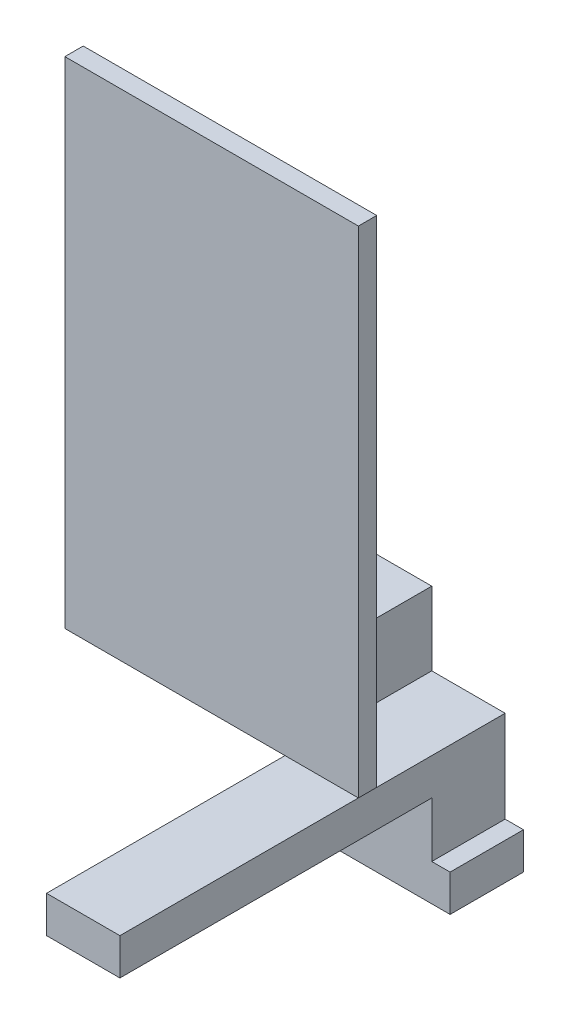
ISO-10303-21;
HEADER;
FILE_DESCRIPTION(('STEP AP214'),'2;1');
FILE_NAME('part.step','',(''),(''),'','','');
FILE_SCHEMA(('AUTOMOTIVE_DESIGN { 1 0 10303 214 1 1 1 1 }'));
ENDSEC;
DATA;
#1=APPLICATION_CONTEXT('core data for automotive mechanical design processes');
#2=APPLICATION_PROTOCOL_DEFINITION('international standard','automotive_design',2000,#1);
#3=PRODUCT_CONTEXT('',#1,'mechanical');
#4=PRODUCT('Part','Part','',(#3));
#5=PRODUCT_RELATED_PRODUCT_CATEGORY('part','',(#4));
#6=PRODUCT_DEFINITION_FORMATION('','',#4);
#7=PRODUCT_DEFINITION_CONTEXT('part definition',#1,'design');
#8=PRODUCT_DEFINITION('design','',#6,#7);
#9=PRODUCT_DEFINITION_SHAPE('','',#8);
#10=(LENGTH_UNIT() NAMED_UNIT(*) SI_UNIT(.MILLI.,.METRE.));
#11=(NAMED_UNIT(*) PLANE_ANGLE_UNIT() SI_UNIT($,.RADIAN.));
#12=(NAMED_UNIT(*) SI_UNIT($,.STERADIAN.) SOLID_ANGLE_UNIT());
#13=UNCERTAINTY_MEASURE_WITH_UNIT(LENGTH_MEASURE(1.E-05),#10,'distance_accuracy_value','');
#14=(GEOMETRIC_REPRESENTATION_CONTEXT(3) GLOBAL_UNCERTAINTY_ASSIGNED_CONTEXT((#13)) GLOBAL_UNIT_ASSIGNED_CONTEXT((#10,
#11,#12)) REPRESENTATION_CONTEXT('',''));
#15=CARTESIAN_POINT('',(0.,0.,0.));
#16=DIRECTION('',(0.,0.,1.));
#17=DIRECTION('',(1.,0.,0.));
#18=AXIS2_PLACEMENT_3D('',#15,#16,#17);
#19=CARTESIAN_POINT('',(0.,0.,0.));
#20=DIRECTION('',(0.,0.,1.));
#21=DIRECTION('',(1.,0.,0.));
#22=AXIS2_PLACEMENT_3D('',#19,#20,#21);
#23=PLANE('',#22);
#24=DIRECTION('',(-1.,0.,0.));
#25=VECTOR('',#24,1.);
#26=CARTESIAN_POINT('',(-40.,30.,0.));
#27=LINE('',#26,#25);
#28=CARTESIAN_POINT('',(-10.,30.,0.));
#29=VERTEX_POINT('',#28);
#30=CARTESIAN_POINT('',(-40.,30.,0.));
#31=VERTEX_POINT('',#30);
#32=EDGE_CURVE('E317',#29,#31,#27,.T.);
#33=ORIENTED_EDGE('',*,*,#32,.F.);
#34=DIRECTION('',(0.,-1.,0.));
#35=VECTOR('',#34,1.);
#36=CARTESIAN_POINT('',(-10.,100.,0.));
#37=LINE('',#36,#35);
#38=CARTESIAN_POINT('',(-10.,10.,0.));
#39=VERTEX_POINT('',#38);
#40=EDGE_CURVE('E199',#29,#39,#37,.T.);
#41=ORIENTED_EDGE('',*,*,#40,.T.);
#42=DIRECTION('',(1.,0.,0.));
#43=VECTOR('',#42,1.);
#44=CARTESIAN_POINT('',(10.,10.,0.));
#45=LINE('',#44,#43);
#46=CARTESIAN_POINT('',(10.,10.,0.));
#47=VERTEX_POINT('',#46);
#48=EDGE_CURVE('E196',#39,#47,#45,.T.);
#49=ORIENTED_EDGE('',*,*,#48,.T.);
#50=DIRECTION('',(0.,1.,0.));
#51=VECTOR('',#50,1.);
#52=CARTESIAN_POINT('',(10.,0.,0.));
#53=LINE('',#52,#51);
#54=CARTESIAN_POINT('',(10.,-15.,0.));
#55=VERTEX_POINT('',#54);
#56=EDGE_CURVE('E158',#55,#47,#53,.T.);
#57=ORIENTED_EDGE('',*,*,#56,.F.);
#58=DIRECTION('',(-1.,0.,0.));
#59=VECTOR('',#58,1.);
#60=CARTESIAN_POINT('',(10.,-15.,0.));
#61=LINE('',#60,#59);
#62=CARTESIAN_POINT('',(15.,-15.,0.));
#63=VERTEX_POINT('',#62);
#64=EDGE_CURVE('E154',#63,#55,#61,.T.);
#65=ORIENTED_EDGE('',*,*,#64,.F.);
#66=DIRECTION('',(0.,1.,0.));
#67=VECTOR('',#66,1.);
#68=CARTESIAN_POINT('',(15.,-15.,0.));
#69=LINE('',#68,#67);
#70=CARTESIAN_POINT('',(15.,-25.,0.));
#71=VERTEX_POINT('',#70);
#72=EDGE_CURVE('E150',#71,#63,#69,.T.);
#73=ORIENTED_EDGE('',*,*,#72,.F.);
#74=DIRECTION('',(1.,0.,0.));
#75=VECTOR('',#74,1.);
#76=CARTESIAN_POINT('',(-15.,-25.,0.));
#77=LINE('',#76,#75);
#78=CARTESIAN_POINT('',(-15.,-25.,0.));
#79=VERTEX_POINT('',#78);
#80=EDGE_CURVE('E101',#79,#71,#77,.T.);
#81=ORIENTED_EDGE('',*,*,#80,.F.);
#82=DIRECTION('',(0.,-1.,0.));
#83=VECTOR('',#82,1.);
#84=CARTESIAN_POINT('',(-15.,-15.,0.));
#85=LINE('',#84,#83);
#86=CARTESIAN_POINT('',(-15.,-15.,0.));
#87=VERTEX_POINT('',#86);
#88=EDGE_CURVE('E167',#87,#79,#85,.T.);
#89=ORIENTED_EDGE('',*,*,#88,.F.);
#90=DIRECTION('',(-1.,0.,0.));
#91=VECTOR('',#90,1.);
#92=CARTESIAN_POINT('',(-10.,-15.,0.));
#93=LINE('',#92,#91);
#94=CARTESIAN_POINT('',(-10.,-15.,0.));
#95=VERTEX_POINT('',#94);
#96=EDGE_CURVE('E135',#95,#87,#93,.T.);
#97=ORIENTED_EDGE('',*,*,#96,.F.);
#98=DIRECTION('',(0.,-1.,0.));
#99=VECTOR('',#98,1.);
#100=CARTESIAN_POINT('',(-10.,0.,0.));
#101=LINE('',#100,#99);
#102=CARTESIAN_POINT('',(-10.,0.,0.));
#103=VERTEX_POINT('',#102);
#104=EDGE_CURVE('E162',#103,#95,#101,.T.);
#105=ORIENTED_EDGE('',*,*,#104,.F.);
#106=DIRECTION('',(-1.,0.,0.));
#107=VECTOR('',#106,1.);
#108=CARTESIAN_POINT('',(-10.,0.,0.));
#109=LINE('',#108,#107);
#110=CARTESIAN_POINT('',(-40.,0.,0.));
#111=VERTEX_POINT('',#110);
#112=EDGE_CURVE('E221',#103,#111,#109,.T.);
#113=ORIENTED_EDGE('',*,*,#112,.T.);
#114=DIRECTION('',(0.,1.,0.));
#115=VECTOR('',#114,1.);
#116=CARTESIAN_POINT('',(-40.,0.,0.));
#117=LINE('',#116,#115);
#118=EDGE_CURVE('E212',#111,#31,#117,.T.);
#119=ORIENTED_EDGE('',*,*,#118,.T.);
#120=EDGE_LOOP('',(#33,#41,#49,#57,#65,#73,#81,#89,#97,#105,#113,#119));
#121=FACE_BOUND('',#120,.T.);
#122=ADVANCED_FACE('F47',(#121),#23,.F.);
#123=CARTESIAN_POINT('',(-40.,0.,131.803398874989));
#124=DIRECTION('',(-1.,0.,0.));
#125=DIRECTION('',(0.,0.,1.));
#126=AXIS2_PLACEMENT_3D('',#123,#124,#125);
#127=PLANE('',#126);
#128=DIRECTION('',(0.,1.,0.));
#129=VECTOR('',#128,1.);
#130=CARTESIAN_POINT('',(-40.,0.,20.));
#131=LINE('',#130,#129);
#132=CARTESIAN_POINT('',(-40.,0.,20.));
#133=VERTEX_POINT('',#132);
#134=CARTESIAN_POINT('',(-40.,15.,20.));
#135=VERTEX_POINT('',#134);
#136=EDGE_CURVE('E230',#133,#135,#131,.T.);
#137=ORIENTED_EDGE('',*,*,#136,.T.);
#138=DIRECTION('',(0.,0.,-1.));
#139=VECTOR('',#138,1.);
#140=CARTESIAN_POINT('',(-40.,15.,40.));
#141=LINE('',#140,#139);
#142=CARTESIAN_POINT('',(-40.,15.,40.));
#143=VERTEX_POINT('',#142);
#144=EDGE_CURVE('E320',#143,#135,#141,.T.);
#145=ORIENTED_EDGE('',*,*,#144,.F.);
#146=DIRECTION('',(0.,-1.,0.));
#147=VECTOR('',#146,1.);
#148=CARTESIAN_POINT('',(-40.,30.,40.));
#149=LINE('',#148,#147);
#150=CARTESIAN_POINT('',(-40.,30.,40.));
#151=VERTEX_POINT('',#150);
#152=EDGE_CURVE('E302',#151,#143,#149,.T.);
#153=ORIENTED_EDGE('',*,*,#152,.F.);
#154=DIRECTION('',(0.,0.,1.));
#155=VECTOR('',#154,1.);
#156=CARTESIAN_POINT('',(-40.,30.,0.));
#157=LINE('',#156,#155);
#158=EDGE_CURVE('E298',#31,#151,#157,.T.);
#159=ORIENTED_EDGE('',*,*,#158,.F.);
#160=ORIENTED_EDGE('',*,*,#118,.F.);
#161=DIRECTION('',(0.,0.,-1.));
#162=VECTOR('',#161,1.);
#163=CARTESIAN_POINT('',(-40.,0.,131.803398874989));
#164=LINE('',#163,#162);
#165=EDGE_CURVE('E210',#133,#111,#164,.T.);
#166=ORIENTED_EDGE('',*,*,#165,.F.);
#167=EDGE_LOOP('',(#137,#145,#153,#159,#160,#166));
#168=FACE_BOUND('',#167,.T.);
#169=ADVANCED_FACE('F260',(#168),#127,.T.);
#170=CARTESIAN_POINT('',(-10.,100.,131.803398874989));
#171=DIRECTION('',(1.,0.,0.));
#172=DIRECTION('',(0.,1.,0.));
#173=AXIS2_PLACEMENT_3D('',#170,#171,#172);
#174=PLANE('',#173);
#175=ORIENTED_EDGE('',*,*,#40,.F.);
#176=DIRECTION('',(0.,0.,-1.));
#177=VECTOR('',#176,1.);
#178=CARTESIAN_POINT('',(-10.,30.,0.));
#179=LINE('',#178,#177);
#180=CARTESIAN_POINT('',(-10.,30.,40.));
#181=VERTEX_POINT('',#180);
#182=EDGE_CURVE('E311',#181,#29,#179,.T.);
#183=ORIENTED_EDGE('',*,*,#182,.F.);
#184=DIRECTION('',(0.,1.,0.));
#185=VECTOR('',#184,1.);
#186=CARTESIAN_POINT('',(-10.,15.,40.));
#187=LINE('',#186,#185);
#188=CARTESIAN_POINT('',(-10.,15.,40.));
#189=VERTEX_POINT('',#188);
#190=EDGE_CURVE('E488',#189,#181,#187,.T.);
#191=ORIENTED_EDGE('',*,*,#190,.F.);
#192=DIRECTION('',(0.,0.,-1.));
#193=VECTOR('',#192,1.);
#194=CARTESIAN_POINT('',(-10.,15.,40.));
#195=LINE('',#194,#193);
#196=CARTESIAN_POINT('',(-10.,15.,20.));
#197=VERTEX_POINT('',#196);
#198=EDGE_CURVE('E312',#189,#197,#195,.T.);
#199=ORIENTED_EDGE('',*,*,#198,.T.);
#200=DIRECTION('',(0.,-1.,0.));
#201=VECTOR('',#200,1.);
#202=CARTESIAN_POINT('',(-10.,100.,20.));
#203=LINE('',#202,#201);
#204=CARTESIAN_POINT('',(-10.,10.,20.));
#205=VERTEX_POINT('',#204);
#206=EDGE_CURVE('E225',#197,#205,#203,.T.);
#207=ORIENTED_EDGE('',*,*,#206,.T.);
#208=DIRECTION('',(0.,0.,-1.));
#209=VECTOR('',#208,1.);
#210=CARTESIAN_POINT('',(-10.,10.,131.803398874989));
#211=LINE('',#210,#209);
#212=EDGE_CURVE('E229',#205,#39,#211,.T.);
#213=ORIENTED_EDGE('',*,*,#212,.T.);
#214=EDGE_LOOP('',(#175,#183,#191,#199,#207,#213));
#215=FACE_BOUND('',#214,.T.);
#216=ADVANCED_FACE('F266',(#215),#174,.T.);
#217=CARTESIAN_POINT('',(0.,0.,20.));
#218=DIRECTION('',(0.,0.,1.));
#219=DIRECTION('',(1.,0.,0.));
#220=AXIS2_PLACEMENT_3D('',#217,#218,#219);
#221=PLANE('',#220);
#222=ORIENTED_EDGE('',*,*,#206,.F.);
#223=DIRECTION('',(1.,0.,0.));
#224=VECTOR('',#223,1.);
#225=CARTESIAN_POINT('',(-65.,15.,20.));
#226=LINE('',#225,#224);
#227=EDGE_CURVE('E326',#135,#197,#226,.T.);
#228=ORIENTED_EDGE('',*,*,#227,.F.);
#229=ORIENTED_EDGE('',*,*,#136,.F.);
#230=DIRECTION('',(-1.,0.,0.));
#231=VECTOR('',#230,1.);
#232=CARTESIAN_POINT('',(-10.,0.,20.));
#233=LINE('',#232,#231);
#234=CARTESIAN_POINT('',(-10.,0.,20.));
#235=VERTEX_POINT('',#234);
#236=EDGE_CURVE('E205',#235,#133,#233,.T.);
#237=ORIENTED_EDGE('',*,*,#236,.F.);
#238=DIRECTION('',(0.,-1.,0.));
#239=VECTOR('',#238,1.);
#240=CARTESIAN_POINT('',(-10.,10.,20.));
#241=LINE('',#240,#239);
#242=EDGE_CURVE('E350',#205,#235,#241,.T.);
#243=ORIENTED_EDGE('',*,*,#242,.F.);
#244=EDGE_LOOP('',(#222,#228,#229,#237,#243));
#245=FACE_BOUND('',#244,.T.);
#246=ADVANCED_FACE('F271',(#245),#221,.T.);
#247=DIRECTION('',(1.,0.,0.));
#248=VECTOR('',#247,1.);
#249=CARTESIAN_POINT('',(10.,0.,20.));
#250=LINE('',#249,#248);
#251=CARTESIAN_POINT('',(10.,0.,20.));
#252=VERTEX_POINT('',#251);
#253=EDGE_CURVE('E356',#235,#252,#250,.T.);
#254=ORIENTED_EDGE('',*,*,#253,.F.);
#255=DIRECTION('',(0.,-1.,0.));
#256=VECTOR('',#255,1.);
#257=CARTESIAN_POINT('',(-10.,0.,20.));
#258=LINE('',#257,#256);
#259=CARTESIAN_POINT('',(-10.,-15.,20.));
#260=VERTEX_POINT('',#259);
#261=EDGE_CURVE('E125',#235,#260,#258,.T.);
#262=ORIENTED_EDGE('',*,*,#261,.T.);
#263=DIRECTION('',(-1.,0.,0.));
#264=VECTOR('',#263,1.);
#265=CARTESIAN_POINT('',(-10.,-15.,20.));
#266=LINE('',#265,#264);
#267=CARTESIAN_POINT('',(-15.,-15.,20.));
#268=VERTEX_POINT('',#267);
#269=EDGE_CURVE('E118',#260,#268,#266,.T.);
#270=ORIENTED_EDGE('',*,*,#269,.T.);
#271=DIRECTION('',(0.,-1.,0.));
#272=VECTOR('',#271,1.);
#273=CARTESIAN_POINT('',(-15.,-15.,20.));
#274=LINE('',#273,#272);
#275=CARTESIAN_POINT('',(-15.,-25.,20.));
#276=VERTEX_POINT('',#275);
#277=EDGE_CURVE('E122',#268,#276,#274,.T.);
#278=ORIENTED_EDGE('',*,*,#277,.T.);
#279=DIRECTION('',(1.,0.,0.));
#280=VECTOR('',#279,1.);
#281=CARTESIAN_POINT('',(-15.,-25.,20.));
#282=LINE('',#281,#280);
#283=CARTESIAN_POINT('',(15.,-25.,20.));
#284=VERTEX_POINT('',#283);
#285=EDGE_CURVE('E71',#276,#284,#282,.T.);
#286=ORIENTED_EDGE('',*,*,#285,.T.);
#287=DIRECTION('',(0.,1.,0.));
#288=VECTOR('',#287,1.);
#289=CARTESIAN_POINT('',(15.,-15.,20.));
#290=LINE('',#289,#288);
#291=CARTESIAN_POINT('',(15.,-15.,20.));
#292=VERTEX_POINT('',#291);
#293=EDGE_CURVE('E172',#284,#292,#290,.T.);
#294=ORIENTED_EDGE('',*,*,#293,.T.);
#295=DIRECTION('',(-1.,0.,0.));
#296=VECTOR('',#295,1.);
#297=CARTESIAN_POINT('',(10.,-15.,20.));
#298=LINE('',#297,#296);
#299=CARTESIAN_POINT('',(10.,-15.,20.));
#300=VERTEX_POINT('',#299);
#301=EDGE_CURVE('E108',#292,#300,#298,.T.);
#302=ORIENTED_EDGE('',*,*,#301,.T.);
#303=DIRECTION('',(0.,1.,0.));
#304=VECTOR('',#303,1.);
#305=CARTESIAN_POINT('',(10.,0.,20.));
#306=LINE('',#305,#304);
#307=EDGE_CURVE('E63',#300,#252,#306,.T.);
#308=ORIENTED_EDGE('',*,*,#307,.T.);
#309=EDGE_LOOP('',(#254,#262,#270,#278,#286,#294,#302,#308));
#310=FACE_BOUND('',#309,.T.);
#311=ADVANCED_FACE('F120',(#310),#221,.T.);
#312=CARTESIAN_POINT('',(15.,-15.,20.));
#313=DIRECTION('',(-1.,0.,0.));
#314=DIRECTION('',(0.,0.,1.));
#315=AXIS2_PLACEMENT_3D('',#312,#313,#314);
#316=PLANE('',#315);
#317=ORIENTED_EDGE('',*,*,#72,.T.);
#318=DIRECTION('',(0.,0.,-1.));
#319=VECTOR('',#318,1.);
#320=CARTESIAN_POINT('',(15.,-15.,20.));
#321=LINE('',#320,#319);
#322=EDGE_CURVE('E11',#292,#63,#321,.T.);
#323=ORIENTED_EDGE('',*,*,#322,.F.);
#324=ORIENTED_EDGE('',*,*,#293,.F.);
#325=DIRECTION('',(0.,0.,-1.));
#326=VECTOR('',#325,1.);
#327=CARTESIAN_POINT('',(15.,-25.,20.));
#328=LINE('',#327,#326);
#329=EDGE_CURVE('E146',#284,#71,#328,.T.);
#330=ORIENTED_EDGE('',*,*,#329,.T.);
#331=EDGE_LOOP('',(#317,#323,#324,#330));
#332=FACE_BOUND('',#331,.T.);
#333=ADVANCED_FACE('F49',(#332),#316,.F.);
#334=CARTESIAN_POINT('',(10.,-15.,20.));
#335=DIRECTION('',(0.,-1.,0.));
#336=DIRECTION('',(0.,0.,-1.));
#337=AXIS2_PLACEMENT_3D('',#334,#335,#336);
#338=PLANE('',#337);
#339=ORIENTED_EDGE('',*,*,#64,.T.);
#340=DIRECTION('',(0.,0.,-1.));
#341=VECTOR('',#340,1.);
#342=CARTESIAN_POINT('',(10.,-15.,20.));
#343=LINE('',#342,#341);
#344=EDGE_CURVE('E56',#300,#55,#343,.T.);
#345=ORIENTED_EDGE('',*,*,#344,.F.);
#346=ORIENTED_EDGE('',*,*,#301,.F.);
#347=ORIENTED_EDGE('',*,*,#322,.T.);
#348=EDGE_LOOP('',(#339,#345,#346,#347));
#349=FACE_BOUND('',#348,.T.);
#350=ADVANCED_FACE('F250',(#349),#338,.F.);
#351=CARTESIAN_POINT('',(10.,0.,20.));
#352=DIRECTION('',(-1.,0.,0.));
#353=DIRECTION('',(0.,-1.,0.));
#354=AXIS2_PLACEMENT_3D('',#351,#352,#353);
#355=PLANE('',#354);
#356=ORIENTED_EDGE('',*,*,#56,.T.);
#357=DIRECTION('',(0.,0.,-1.));
#358=VECTOR('',#357,1.);
#359=CARTESIAN_POINT('',(10.,10.,131.803398874989));
#360=LINE('',#359,#358);
#361=CARTESIAN_POINT('',(10.,10.,105.));
#362=VERTEX_POINT('',#361);
#363=EDGE_CURVE('E155',#362,#47,#360,.T.);
#364=ORIENTED_EDGE('',*,*,#363,.F.);
#365=DIRECTION('',(0.,1.,0.));
#366=VECTOR('',#365,1.);
#367=CARTESIAN_POINT('',(10.,10.,105.));
#368=LINE('',#367,#366);
#369=CARTESIAN_POINT('',(10.,0.,105.));
#370=VERTEX_POINT('',#369);
#371=EDGE_CURVE('E351',#370,#362,#368,.T.);
#372=ORIENTED_EDGE('',*,*,#371,.F.);
#373=DIRECTION('',(0.,0.,-1.));
#374=VECTOR('',#373,1.);
#375=CARTESIAN_POINT('',(10.,0.,105.));
#376=LINE('',#375,#374);
#377=EDGE_CURVE('E368',#370,#252,#376,.T.);
#378=ORIENTED_EDGE('',*,*,#377,.T.);
#379=ORIENTED_EDGE('',*,*,#307,.F.);
#380=ORIENTED_EDGE('',*,*,#344,.T.);
#381=EDGE_LOOP('',(#356,#364,#372,#378,#379,#380));
#382=FACE_BOUND('',#381,.T.);
#383=ADVANCED_FACE('F186',(#382),#355,.F.);
#384=CARTESIAN_POINT('',(-10.,0.,20.));
#385=DIRECTION('',(1.,0.,0.));
#386=DIRECTION('',(0.,1.,0.));
#387=AXIS2_PLACEMENT_3D('',#384,#385,#386);
#388=PLANE('',#387);
#389=ORIENTED_EDGE('',*,*,#104,.T.);
#390=DIRECTION('',(0.,0.,-1.));
#391=VECTOR('',#390,1.);
#392=CARTESIAN_POINT('',(-10.,-15.,20.));
#393=LINE('',#392,#391);
#394=EDGE_CURVE('E139',#260,#95,#393,.T.);
#395=ORIENTED_EDGE('',*,*,#394,.F.);
#396=ORIENTED_EDGE('',*,*,#261,.F.);
#397=DIRECTION('',(0.,0.,-1.));
#398=VECTOR('',#397,1.);
#399=CARTESIAN_POINT('',(-10.,0.,20.));
#400=LINE('',#399,#398);
#401=EDGE_CURVE('E179',#235,#103,#400,.T.);
#402=ORIENTED_EDGE('',*,*,#401,.T.);
#403=EDGE_LOOP('',(#389,#395,#396,#402));
#404=FACE_BOUND('',#403,.T.);
#405=ADVANCED_FACE('F257',(#404),#388,.F.);
#406=CARTESIAN_POINT('',(-10.,-15.,20.));
#407=DIRECTION('',(0.,-1.,0.));
#408=DIRECTION('',(0.,0.,-1.));
#409=AXIS2_PLACEMENT_3D('',#406,#407,#408);
#410=PLANE('',#409);
#411=ORIENTED_EDGE('',*,*,#96,.T.);
#412=DIRECTION('',(0.,0.,-1.));
#413=VECTOR('',#412,1.);
#414=CARTESIAN_POINT('',(-15.,-15.,20.));
#415=LINE('',#414,#413);
#416=EDGE_CURVE('E132',#268,#87,#415,.T.);
#417=ORIENTED_EDGE('',*,*,#416,.F.);
#418=ORIENTED_EDGE('',*,*,#269,.F.);
#419=ORIENTED_EDGE('',*,*,#394,.T.);
#420=EDGE_LOOP('',(#411,#417,#418,#419));
#421=FACE_BOUND('',#420,.T.);
#422=ADVANCED_FACE('F133',(#421),#410,.F.);
#423=CARTESIAN_POINT('',(-15.,-15.,20.));
#424=DIRECTION('',(1.,0.,0.));
#425=DIRECTION('',(0.,1.,0.));
#426=AXIS2_PLACEMENT_3D('',#423,#424,#425);
#427=PLANE('',#426);
#428=ORIENTED_EDGE('',*,*,#88,.T.);
#429=DIRECTION('',(0.,0.,-1.));
#430=VECTOR('',#429,1.);
#431=CARTESIAN_POINT('',(-15.,-25.,20.));
#432=LINE('',#431,#430);
#433=EDGE_CURVE('E140',#276,#79,#432,.T.);
#434=ORIENTED_EDGE('',*,*,#433,.F.);
#435=ORIENTED_EDGE('',*,*,#277,.F.);
#436=ORIENTED_EDGE('',*,*,#416,.T.);
#437=EDGE_LOOP('',(#428,#434,#435,#436));
#438=FACE_BOUND('',#437,.T.);
#439=ADVANCED_FACE('F142',(#438),#427,.F.);
#440=CARTESIAN_POINT('',(-15.,-25.,20.));
#441=DIRECTION('',(0.,1.,0.));
#442=DIRECTION('',(-1.,0.,0.));
#443=AXIS2_PLACEMENT_3D('',#440,#441,#442);
#444=PLANE('',#443);
#445=ORIENTED_EDGE('',*,*,#80,.T.);
#446=ORIENTED_EDGE('',*,*,#329,.F.);
#447=ORIENTED_EDGE('',*,*,#285,.F.);
#448=ORIENTED_EDGE('',*,*,#433,.T.);
#449=EDGE_LOOP('',(#445,#446,#447,#448));
#450=FACE_BOUND('',#449,.T.);
#451=ADVANCED_FACE('F273',(#450),#444,.F.);
#452=CARTESIAN_POINT('',(-10.,0.,131.803398874989));
#453=DIRECTION('',(0.,-1.,0.));
#454=DIRECTION('',(1.,0.,0.));
#455=AXIS2_PLACEMENT_3D('',#452,#453,#454);
#456=PLANE('',#455);
#457=ORIENTED_EDGE('',*,*,#401,.F.);
#458=ORIENTED_EDGE('',*,*,#236,.T.);
#459=ORIENTED_EDGE('',*,*,#165,.T.);
#460=ORIENTED_EDGE('',*,*,#112,.F.);
#461=EDGE_LOOP('',(#457,#458,#459,#460));
#462=FACE_BOUND('',#461,.T.);
#463=ADVANCED_FACE('F276',(#462),#456,.T.);
#464=CARTESIAN_POINT('',(10.,10.,131.803398874989));
#465=DIRECTION('',(0.,1.,0.));
#466=DIRECTION('',(0.,0.,1.));
#467=AXIS2_PLACEMENT_3D('',#464,#465,#466);
#468=PLANE('',#467);
#469=ORIENTED_EDGE('',*,*,#212,.F.);
#470=DIRECTION('',(0.,0.,-1.));
#471=VECTOR('',#470,1.);
#472=CARTESIAN_POINT('',(-10.,10.,105.));
#473=LINE('',#472,#471);
#474=CARTESIAN_POINT('',(-10.,10.,105.));
#475=VERTEX_POINT('',#474);
#476=EDGE_CURVE('E215',#475,#205,#473,.T.);
#477=ORIENTED_EDGE('',*,*,#476,.F.);
#478=DIRECTION('',(-1.,0.,0.));
#479=VECTOR('',#478,1.);
#480=CARTESIAN_POINT('',(10.,10.,105.));
#481=LINE('',#480,#479);
#482=EDGE_CURVE('E355',#362,#475,#481,.T.);
#483=ORIENTED_EDGE('',*,*,#482,.F.);
#484=ORIENTED_EDGE('',*,*,#363,.T.);
#485=ORIENTED_EDGE('',*,*,#48,.F.);
#486=EDGE_LOOP('',(#469,#477,#483,#484,#485));
#487=FACE_BOUND('',#486,.T.);
#488=ADVANCED_FACE('F392',(#487),#468,.T.);
#489=CARTESIAN_POINT('',(-10.,10.,105.));
#490=DIRECTION('',(1.,0.,0.));
#491=DIRECTION('',(0.,0.,-1.));
#492=AXIS2_PLACEMENT_3D('',#489,#490,#491);
#493=PLANE('',#492);
#494=ORIENTED_EDGE('',*,*,#242,.T.);
#495=DIRECTION('',(0.,0.,-1.));
#496=VECTOR('',#495,1.);
#497=CARTESIAN_POINT('',(-10.,0.,105.));
#498=LINE('',#497,#496);
#499=CARTESIAN_POINT('',(-10.,0.,105.));
#500=VERTEX_POINT('',#499);
#501=EDGE_CURVE('E375',#500,#235,#498,.T.);
#502=ORIENTED_EDGE('',*,*,#501,.F.);
#503=DIRECTION('',(0.,-1.,0.));
#504=VECTOR('',#503,1.);
#505=CARTESIAN_POINT('',(-10.,10.,105.));
#506=LINE('',#505,#504);
#507=EDGE_CURVE('E360',#475,#500,#506,.T.);
#508=ORIENTED_EDGE('',*,*,#507,.F.);
#509=ORIENTED_EDGE('',*,*,#476,.T.);
#510=EDGE_LOOP('',(#494,#502,#508,#509));
#511=FACE_BOUND('',#510,.T.);
#512=ADVANCED_FACE('F387',(#511),#493,.F.);
#513=CARTESIAN_POINT('',(10.,0.,105.));
#514=DIRECTION('',(0.,1.,0.));
#515=DIRECTION('',(0.,0.,1.));
#516=AXIS2_PLACEMENT_3D('',#513,#514,#515);
#517=PLANE('',#516);
#518=ORIENTED_EDGE('',*,*,#253,.T.);
#519=ORIENTED_EDGE('',*,*,#377,.F.);
#520=DIRECTION('',(1.,0.,0.));
#521=VECTOR('',#520,1.);
#522=CARTESIAN_POINT('',(10.,0.,105.));
#523=LINE('',#522,#521);
#524=EDGE_CURVE('E364',#500,#370,#523,.T.);
#525=ORIENTED_EDGE('',*,*,#524,.F.);
#526=ORIENTED_EDGE('',*,*,#501,.T.);
#527=EDGE_LOOP('',(#518,#519,#525,#526));
#528=FACE_BOUND('',#527,.T.);
#529=ADVANCED_FACE('F514',(#528),#517,.F.);
#530=CARTESIAN_POINT('',(0.,0.,105.));
#531=DIRECTION('',(0.,0.,-1.));
#532=DIRECTION('',(-1.,0.,0.));
#533=AXIS2_PLACEMENT_3D('',#530,#531,#532);
#534=PLANE('',#533);
#535=ORIENTED_EDGE('',*,*,#371,.T.);
#536=ORIENTED_EDGE('',*,*,#482,.T.);
#537=ORIENTED_EDGE('',*,*,#507,.T.);
#538=ORIENTED_EDGE('',*,*,#524,.T.);
#539=EDGE_LOOP('',(#535,#536,#537,#538));
#540=FACE_BOUND('',#539,.T.);
#541=ADVANCED_FACE('F506',(#540),#534,.F.);
#542=CARTESIAN_POINT('',(-65.,100.,45.));
#543=DIRECTION('',(1.,0.,0.));
#544=DIRECTION('',(0.,1.,0.));
#545=AXIS2_PLACEMENT_3D('',#542,#543,#544);
#546=PLANE('',#545);
#547=DIRECTION('',(0.,-1.,0.));
#548=VECTOR('',#547,1.);
#549=CARTESIAN_POINT('',(-65.,100.,45.));
#550=LINE('',#549,#548);
#551=CARTESIAN_POINT('',(-65.,150.,45.));
#552=VERTEX_POINT('',#551);
#553=CARTESIAN_POINT('',(-65.,15.,45.));
#554=VERTEX_POINT('',#553);
#555=EDGE_CURVE('E327',#552,#554,#550,.T.);
#556=ORIENTED_EDGE('',*,*,#555,.F.);
#557=DIRECTION('',(0.,0.,1.));
#558=VECTOR('',#557,1.);
#559=CARTESIAN_POINT('',(-65.,150.,40.));
#560=LINE('',#559,#558);
#561=CARTESIAN_POINT('',(-65.,150.,40.));
#562=VERTEX_POINT('',#561);
#563=EDGE_CURVE('E463',#562,#552,#560,.T.);
#564=ORIENTED_EDGE('',*,*,#563,.F.);
#565=DIRECTION('',(0.,1.,0.));
#566=VECTOR('',#565,1.);
#567=CARTESIAN_POINT('',(-65.,15.,40.));
#568=LINE('',#567,#566);
#569=CARTESIAN_POINT('',(-65.,15.,40.));
#570=VERTEX_POINT('',#569);
#571=EDGE_CURVE('E453',#570,#562,#568,.T.);
#572=ORIENTED_EDGE('',*,*,#571,.F.);
#573=DIRECTION('',(0.,0.,-1.));
#574=VECTOR('',#573,1.);
#575=CARTESIAN_POINT('',(-65.,15.,45.));
#576=LINE('',#575,#574);
#577=EDGE_CURVE('E346',#554,#570,#576,.T.);
#578=ORIENTED_EDGE('',*,*,#577,.F.);
#579=EDGE_LOOP('',(#556,#564,#572,#578));
#580=FACE_BOUND('',#579,.T.);
#581=ADVANCED_FACE('F504',(#580),#546,.F.);
#582=CARTESIAN_POINT('',(-65.,15.,45.));
#583=DIRECTION('',(0.,1.,0.));
#584=DIRECTION('',(0.,0.,1.));
#585=AXIS2_PLACEMENT_3D('',#582,#583,#584);
#586=PLANE('',#585);
#587=DIRECTION('',(-1.,0.,0.));
#588=VECTOR('',#587,1.);
#589=CARTESIAN_POINT('',(-40.,15.,40.));
#590=LINE('',#589,#588);
#591=EDGE_CURVE('E481',#143,#570,#590,.T.);
#592=ORIENTED_EDGE('',*,*,#591,.F.);
#593=ORIENTED_EDGE('',*,*,#144,.T.);
#594=ORIENTED_EDGE('',*,*,#227,.T.);
#595=ORIENTED_EDGE('',*,*,#198,.F.);
#596=DIRECTION('',(-1.,0.,0.));
#597=VECTOR('',#596,1.);
#598=CARTESIAN_POINT('',(15.,15.,40.));
#599=LINE('',#598,#597);
#600=CARTESIAN_POINT('',(15.,15.,40.));
#601=VERTEX_POINT('',#600);
#602=EDGE_CURVE('E452',#601,#189,#599,.T.);
#603=ORIENTED_EDGE('',*,*,#602,.F.);
#604=DIRECTION('',(0.,0.,-1.));
#605=VECTOR('',#604,1.);
#606=CARTESIAN_POINT('',(15.,15.,45.));
#607=LINE('',#606,#605);
#608=CARTESIAN_POINT('',(15.,15.,45.));
#609=VERTEX_POINT('',#608);
#610=EDGE_CURVE('E339',#609,#601,#607,.T.);
#611=ORIENTED_EDGE('',*,*,#610,.F.);
#612=DIRECTION('',(1.,0.,0.));
#613=VECTOR('',#612,1.);
#614=CARTESIAN_POINT('',(-65.,15.,45.));
#615=LINE('',#614,#613);
#616=EDGE_CURVE('E331',#554,#609,#615,.T.);
#617=ORIENTED_EDGE('',*,*,#616,.F.);
#618=ORIENTED_EDGE('',*,*,#577,.T.);
#619=EDGE_LOOP('',(#592,#593,#594,#595,#603,#611,#617,#618));
#620=FACE_BOUND('',#619,.T.);
#621=ADVANCED_FACE('F496',(#620),#586,.F.);
#622=CARTESIAN_POINT('',(15.,100.,45.));
#623=DIRECTION('',(-1.,0.,0.));
#624=DIRECTION('',(0.,-1.,0.));
#625=AXIS2_PLACEMENT_3D('',#622,#623,#624);
#626=PLANE('',#625);
#627=ORIENTED_EDGE('',*,*,#610,.T.);
#628=DIRECTION('',(0.,-1.,0.));
#629=VECTOR('',#628,1.);
#630=CARTESIAN_POINT('',(15.,100.,40.));
#631=LINE('',#630,#629);
#632=CARTESIAN_POINT('',(15.,150.,40.));
#633=VERTEX_POINT('',#632);
#634=EDGE_CURVE('E443',#633,#601,#631,.T.);
#635=ORIENTED_EDGE('',*,*,#634,.F.);
#636=DIRECTION('',(0.,0.,-1.));
#637=VECTOR('',#636,1.);
#638=CARTESIAN_POINT('',(15.,150.,45.));
#639=LINE('',#638,#637);
#640=CARTESIAN_POINT('',(15.,150.,45.));
#641=VERTEX_POINT('',#640);
#642=EDGE_CURVE('E448',#641,#633,#639,.T.);
#643=ORIENTED_EDGE('',*,*,#642,.F.);
#644=DIRECTION('',(0.,1.,0.));
#645=VECTOR('',#644,1.);
#646=CARTESIAN_POINT('',(15.,100.,45.));
#647=LINE('',#646,#645);
#648=EDGE_CURVE('E335',#609,#641,#647,.T.);
#649=ORIENTED_EDGE('',*,*,#648,.F.);
#650=EDGE_LOOP('',(#627,#635,#643,#649));
#651=FACE_BOUND('',#650,.T.);
#652=ADVANCED_FACE('F445',(#651),#626,.F.);
#653=CARTESIAN_POINT('',(0.,0.,45.));
#654=DIRECTION('',(0.,0.,1.));
#655=DIRECTION('',(1.,0.,0.));
#656=AXIS2_PLACEMENT_3D('',#653,#654,#655);
#657=PLANE('',#656);
#658=ORIENTED_EDGE('',*,*,#555,.T.);
#659=ORIENTED_EDGE('',*,*,#616,.T.);
#660=ORIENTED_EDGE('',*,*,#648,.T.);
#661=DIRECTION('',(1.,0.,0.));
#662=VECTOR('',#661,1.);
#663=CARTESIAN_POINT('',(-65.,150.,45.));
#664=LINE('',#663,#662);
#665=EDGE_CURVE('E468',#552,#641,#664,.T.);
#666=ORIENTED_EDGE('',*,*,#665,.F.);
#667=EDGE_LOOP('',(#658,#659,#660,#666));
#668=FACE_BOUND('',#667,.T.);
#669=ADVANCED_FACE('F501',(#668),#657,.T.);
#670=CARTESIAN_POINT('',(0.,30.,0.));
#671=DIRECTION('',(0.,1.,0.));
#672=DIRECTION('',(-1.,0.,0.));
#673=AXIS2_PLACEMENT_3D('',#670,#671,#672);
#674=PLANE('',#673);
#675=ORIENTED_EDGE('',*,*,#158,.T.);
#676=DIRECTION('',(-1.,0.,0.));
#677=VECTOR('',#676,1.);
#678=CARTESIAN_POINT('',(-10.,30.,40.));
#679=LINE('',#678,#677);
#680=EDGE_CURVE('E476',#181,#151,#679,.T.);
#681=ORIENTED_EDGE('',*,*,#680,.F.);
#682=ORIENTED_EDGE('',*,*,#182,.T.);
#683=ORIENTED_EDGE('',*,*,#32,.T.);
#684=EDGE_LOOP('',(#675,#681,#682,#683));
#685=FACE_BOUND('',#684,.T.);
#686=ADVANCED_FACE('F600',(#685),#674,.T.);
#687=CARTESIAN_POINT('',(0.,0.,40.));
#688=DIRECTION('',(0.,0.,1.));
#689=DIRECTION('',(1.,0.,0.));
#690=AXIS2_PLACEMENT_3D('',#687,#688,#689);
#691=PLANE('',#690);
#692=ORIENTED_EDGE('',*,*,#680,.T.);
#693=ORIENTED_EDGE('',*,*,#152,.T.);
#694=ORIENTED_EDGE('',*,*,#591,.T.);
#695=ORIENTED_EDGE('',*,*,#571,.T.);
#696=DIRECTION('',(-1.,0.,0.));
#697=VECTOR('',#696,1.);
#698=CARTESIAN_POINT('',(15.,150.,40.));
#699=LINE('',#698,#697);
#700=EDGE_CURVE('E456',#633,#562,#699,.T.);
#701=ORIENTED_EDGE('',*,*,#700,.F.);
#702=ORIENTED_EDGE('',*,*,#634,.T.);
#703=ORIENTED_EDGE('',*,*,#602,.T.);
#704=ORIENTED_EDGE('',*,*,#190,.T.);
#705=EDGE_LOOP('',(#692,#693,#694,#695,#701,#702,#703,#704));
#706=FACE_BOUND('',#705,.T.);
#707=ADVANCED_FACE('F457',(#706),#691,.F.);
#708=CARTESIAN_POINT('',(0.,150.,0.));
#709=DIRECTION('',(0.,1.,0.));
#710=DIRECTION('',(-1.,0.,0.));
#711=AXIS2_PLACEMENT_3D('',#708,#709,#710);
#712=PLANE('',#711);
#713=ORIENTED_EDGE('',*,*,#642,.T.);
#714=ORIENTED_EDGE('',*,*,#700,.T.);
#715=ORIENTED_EDGE('',*,*,#563,.T.);
#716=ORIENTED_EDGE('',*,*,#665,.T.);
#717=EDGE_LOOP('',(#713,#714,#715,#716));
#718=FACE_BOUND('',#717,.T.);
#719=ADVANCED_FACE('F466',(#718),#712,.T.);
#720=CLOSED_SHELL('',(#122,#169,#216,#246,#311,#333,#350,#383,#405,#422,#439,#451,#463,#488,
#512,#529,#541,#581,#621,#652,#669,#686,#707,#719));
#721=MANIFOLD_SOLID_BREP('B2',#720);
#722=ADVANCED_BREP_SHAPE_REPRESENTATION('',(#18,#721),#14);
#723=SHAPE_DEFINITION_REPRESENTATION(#9,#722);
ENDSEC;
END-ISO-10303-21;
